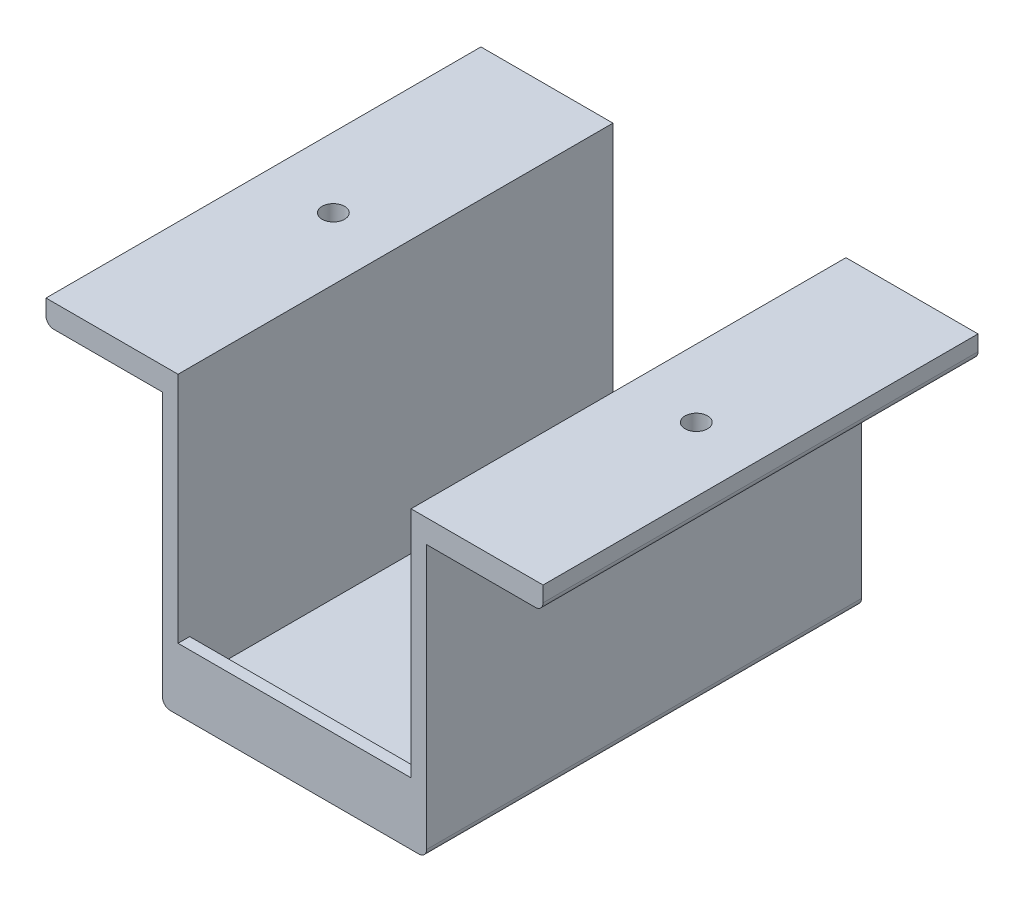
ISO-10303-21;
HEADER;
FILE_DESCRIPTION(('STEP AP214'),'2;1');
FILE_NAME('part.step','',(''),(''),'','','');
FILE_SCHEMA(('AUTOMOTIVE_DESIGN { 1 0 10303 214 1 1 1 1 }'));
ENDSEC;
DATA;
#1=APPLICATION_CONTEXT('core data for automotive mechanical design processes');
#2=APPLICATION_PROTOCOL_DEFINITION('international standard','automotive_design',2000,#1);
#3=PRODUCT_CONTEXT('',#1,'mechanical');
#4=PRODUCT('Part','Part','',(#3));
#5=PRODUCT_RELATED_PRODUCT_CATEGORY('part','',(#4));
#6=PRODUCT_DEFINITION_FORMATION('','',#4);
#7=PRODUCT_DEFINITION_CONTEXT('part definition',#1,'design');
#8=PRODUCT_DEFINITION('design','',#6,#7);
#9=PRODUCT_DEFINITION_SHAPE('','',#8);
#10=(LENGTH_UNIT() NAMED_UNIT(*) SI_UNIT(.MILLI.,.METRE.));
#11=(NAMED_UNIT(*) PLANE_ANGLE_UNIT() SI_UNIT($,.RADIAN.));
#12=(NAMED_UNIT(*) SI_UNIT($,.STERADIAN.) SOLID_ANGLE_UNIT());
#13=UNCERTAINTY_MEASURE_WITH_UNIT(LENGTH_MEASURE(1.E-05),#10,'distance_accuracy_value','');
#14=(GEOMETRIC_REPRESENTATION_CONTEXT(3) GLOBAL_UNCERTAINTY_ASSIGNED_CONTEXT((#13)) GLOBAL_UNIT_ASSIGNED_CONTEXT((#10,
#11,#12)) REPRESENTATION_CONTEXT('',''));
#15=CARTESIAN_POINT('',(0.,0.,0.));
#16=DIRECTION('',(0.,0.,1.));
#17=DIRECTION('',(1.,0.,0.));
#18=AXIS2_PLACEMENT_3D('',#15,#16,#17);
#19=CARTESIAN_POINT('',(0.,3.,0.));
#20=DIRECTION('',(0.,1.,0.));
#21=DIRECTION('',(0.,0.,1.));
#22=AXIS2_PLACEMENT_3D('',#19,#20,#21);
#23=PLANE('',#22);
#24=DIRECTION('',(0.,0.,1.));
#25=VECTOR('',#24,1.);
#26=CARTESIAN_POINT('',(32.,3.,-40.887459807074));
#27=LINE('',#26,#25);
#28=CARTESIAN_POINT('',(32.,3.,-38.887459807074));
#29=VERTEX_POINT('',#28);
#30=CARTESIAN_POINT('',(32.,3.,13.612540192926));
#31=VERTEX_POINT('',#30);
#32=EDGE_CURVE('E283',#29,#31,#27,.T.);
#33=ORIENTED_EDGE('',*,*,#32,.F.);
#34=DIRECTION('',(1.,0.,0.));
#35=VECTOR('',#34,1.);
#36=CARTESIAN_POINT('',(32.,3.,-38.887459807074));
#37=LINE('',#36,#35);
#38=CARTESIAN_POINT('',(2.,3.,-38.887459807074));
#39=VERTEX_POINT('',#38);
#40=EDGE_CURVE('E230',#39,#29,#37,.T.);
#41=ORIENTED_EDGE('',*,*,#40,.F.);
#42=DIRECTION('',(0.,0.,-1.));
#43=VECTOR('',#42,1.);
#44=CARTESIAN_POINT('',(2.,3.,-40.887459807074));
#45=LINE('',#44,#43);
#46=CARTESIAN_POINT('',(2.,3.,13.612540192926));
#47=VERTEX_POINT('',#46);
#48=EDGE_CURVE('E301',#47,#39,#45,.T.);
#49=ORIENTED_EDGE('',*,*,#48,.F.);
#50=DIRECTION('',(-1.,0.,0.));
#51=VECTOR('',#50,1.);
#52=CARTESIAN_POINT('',(2.,3.,13.612540192926));
#53=LINE('',#52,#51);
#54=EDGE_CURVE('E192',#31,#47,#53,.T.);
#55=ORIENTED_EDGE('',*,*,#54,.F.);
#56=EDGE_LOOP('',(#33,#41,#49,#55));
#57=FACE_BOUND('',#56,.T.);
#58=ADVANCED_FACE('F33',(#57),#23,.T.);
#59=CARTESIAN_POINT('',(2.,38.,-40.887459807074));
#60=DIRECTION('',(-1.,0.,0.));
#61=DIRECTION('',(0.,0.,1.));
#62=AXIS2_PLACEMENT_3D('',#59,#60,#61);
#63=PLANE('',#62);
#64=DIRECTION('',(0.,-1.,0.));
#65=VECTOR('',#64,1.);
#66=CARTESIAN_POINT('',(2.,8.,-38.887459807074));
#67=LINE('',#66,#65);
#68=CARTESIAN_POINT('',(2.,8.,-38.887459807074));
#69=VERTEX_POINT('',#68);
#70=EDGE_CURVE('E308',#69,#39,#67,.T.);
#71=ORIENTED_EDGE('',*,*,#70,.F.);
#72=DIRECTION('',(0.,0.,1.));
#73=VECTOR('',#72,1.);
#74=CARTESIAN_POINT('',(2.,8.,-40.887459807074));
#75=LINE('',#74,#73);
#76=CARTESIAN_POINT('',(2.,8.,-40.887459807074));
#77=VERTEX_POINT('',#76);
#78=EDGE_CURVE('E431',#77,#69,#75,.T.);
#79=ORIENTED_EDGE('',*,*,#78,.F.);
#80=DIRECTION('',(0.,-1.,0.));
#81=VECTOR('',#80,1.);
#82=CARTESIAN_POINT('',(2.,38.,-40.887459807074));
#83=LINE('',#82,#81);
#84=CARTESIAN_POINT('',(2.,38.,-40.887459807074));
#85=VERTEX_POINT('',#84);
#86=EDGE_CURVE('E198',#85,#77,#83,.T.);
#87=ORIENTED_EDGE('',*,*,#86,.F.);
#88=DIRECTION('',(0.,0.,-1.));
#89=VECTOR('',#88,1.);
#90=CARTESIAN_POINT('',(2.,38.,-40.887459807074));
#91=LINE('',#90,#89);
#92=CARTESIAN_POINT('',(2.,38.,15.112540192926));
#93=VERTEX_POINT('',#92);
#94=EDGE_CURVE('E196',#93,#85,#91,.T.);
#95=ORIENTED_EDGE('',*,*,#94,.F.);
#96=DIRECTION('',(0.,-1.,0.));
#97=VECTOR('',#96,1.);
#98=CARTESIAN_POINT('',(2.,38.,15.112540192926));
#99=LINE('',#98,#97);
#100=CARTESIAN_POINT('',(2.,8.,15.112540192926));
#101=VERTEX_POINT('',#100);
#102=EDGE_CURVE('E175',#93,#101,#99,.T.);
#103=ORIENTED_EDGE('',*,*,#102,.T.);
#104=DIRECTION('',(0.,0.,1.));
#105=VECTOR('',#104,1.);
#106=CARTESIAN_POINT('',(2.,8.,13.612540192926));
#107=LINE('',#106,#105);
#108=CARTESIAN_POINT('',(2.,8.,13.612540192926));
#109=VERTEX_POINT('',#108);
#110=EDGE_CURVE('E183',#109,#101,#107,.T.);
#111=ORIENTED_EDGE('',*,*,#110,.F.);
#112=DIRECTION('',(0.,-1.,0.));
#113=VECTOR('',#112,1.);
#114=CARTESIAN_POINT('',(2.,8.,13.612540192926));
#115=LINE('',#114,#113);
#116=EDGE_CURVE('E310',#109,#47,#115,.T.);
#117=ORIENTED_EDGE('',*,*,#116,.T.);
#118=ORIENTED_EDGE('',*,*,#48,.T.);
#119=EDGE_LOOP('',(#71,#79,#87,#95,#103,#111,#117,#118));
#120=FACE_BOUND('',#119,.T.);
#121=ADVANCED_FACE('F194',(#120),#63,.F.);
#122=CARTESIAN_POINT('',(32.,38.,-40.887459807074));
#123=DIRECTION('',(1.,0.,0.));
#124=DIRECTION('',(0.,0.,-1.));
#125=AXIS2_PLACEMENT_3D('',#122,#123,#124);
#126=PLANE('',#125);
#127=DIRECTION('',(0.,-1.,0.));
#128=VECTOR('',#127,1.);
#129=CARTESIAN_POINT('',(32.,8.,-38.887459807074));
#130=LINE('',#129,#128);
#131=CARTESIAN_POINT('',(32.,8.,-38.887459807074));
#132=VERTEX_POINT('',#131);
#133=EDGE_CURVE('E320',#132,#29,#130,.T.);
#134=ORIENTED_EDGE('',*,*,#133,.T.);
#135=ORIENTED_EDGE('',*,*,#32,.T.);
#136=DIRECTION('',(0.,-1.,0.));
#137=VECTOR('',#136,1.);
#138=CARTESIAN_POINT('',(32.,8.,13.612540192926));
#139=LINE('',#138,#137);
#140=CARTESIAN_POINT('',(32.,8.,13.612540192926));
#141=VERTEX_POINT('',#140);
#142=EDGE_CURVE('E329',#141,#31,#139,.T.);
#143=ORIENTED_EDGE('',*,*,#142,.F.);
#144=DIRECTION('',(0.,0.,-1.));
#145=VECTOR('',#144,1.);
#146=CARTESIAN_POINT('',(32.,8.,13.612540192926));
#147=LINE('',#146,#145);
#148=CARTESIAN_POINT('',(32.,8.,15.112540192926));
#149=VERTEX_POINT('',#148);
#150=EDGE_CURVE('E182',#149,#141,#147,.T.);
#151=ORIENTED_EDGE('',*,*,#150,.F.);
#152=DIRECTION('',(0.,-1.,0.));
#153=VECTOR('',#152,1.);
#154=CARTESIAN_POINT('',(32.,38.,15.112540192926));
#155=LINE('',#154,#153);
#156=CARTESIAN_POINT('',(32.,38.,15.112540192926));
#157=VERTEX_POINT('',#156);
#158=EDGE_CURVE('E179',#157,#149,#155,.T.);
#159=ORIENTED_EDGE('',*,*,#158,.F.);
#160=DIRECTION('',(0.,0.,1.));
#161=VECTOR('',#160,1.);
#162=CARTESIAN_POINT('',(32.,38.,-40.887459807074));
#163=LINE('',#162,#161);
#164=CARTESIAN_POINT('',(32.,38.,-40.887459807074));
#165=VERTEX_POINT('',#164);
#166=EDGE_CURVE('E293',#165,#157,#163,.T.);
#167=ORIENTED_EDGE('',*,*,#166,.F.);
#168=DIRECTION('',(0.,-1.,0.));
#169=VECTOR('',#168,1.);
#170=CARTESIAN_POINT('',(32.,38.,-40.887459807074));
#171=LINE('',#170,#169);
#172=CARTESIAN_POINT('',(32.,8.,-40.887459807074));
#173=VERTEX_POINT('',#172);
#174=EDGE_CURVE('E299',#165,#173,#171,.T.);
#175=ORIENTED_EDGE('',*,*,#174,.T.);
#176=DIRECTION('',(0.,0.,-1.));
#177=VECTOR('',#176,1.);
#178=CARTESIAN_POINT('',(32.,8.,-40.887459807074));
#179=LINE('',#178,#177);
#180=EDGE_CURVE('E432',#132,#173,#179,.T.);
#181=ORIENTED_EDGE('',*,*,#180,.F.);
#182=EDGE_LOOP('',(#134,#135,#143,#151,#159,#167,#175,#181));
#183=FACE_BOUND('',#182,.T.);
#184=ADVANCED_FACE('F382',(#183),#126,.F.);
#185=CARTESIAN_POINT('',(0.,3.,-40.887459807074));
#186=DIRECTION('',(1.,0.,0.));
#187=DIRECTION('',(0.,0.,-1.));
#188=AXIS2_PLACEMENT_3D('',#185,#186,#187);
#189=PLANE('',#188);
#190=DIRECTION('',(0.,-1.,0.));
#191=VECTOR('',#190,1.);
#192=CARTESIAN_POINT('',(0.,3.,-40.887459807074));
#193=LINE('',#192,#191);
#194=CARTESIAN_POINT('',(0.,35.0081400054375,-40.887459807074));
#195=VERTEX_POINT('',#194);
#196=CARTESIAN_POINT('',(0.,1.,-40.887459807074));
#197=VERTEX_POINT('',#196);
#198=EDGE_CURVE('E210',#195,#197,#193,.T.);
#199=ORIENTED_EDGE('',*,*,#198,.T.);
#200=DIRECTION('',(0.,0.,1.));
#201=VECTOR('',#200,1.);
#202=CARTESIAN_POINT('',(0.,1.,-40.887459807074));
#203=LINE('',#202,#201);
#204=CARTESIAN_POINT('',(0.,1.,15.112540192926));
#205=VERTEX_POINT('',#204);
#206=EDGE_CURVE('E11',#197,#205,#203,.T.);
#207=ORIENTED_EDGE('',*,*,#206,.T.);
#208=DIRECTION('',(0.,-1.,0.));
#209=VECTOR('',#208,1.);
#210=CARTESIAN_POINT('',(0.,3.,15.112540192926));
#211=LINE('',#210,#209);
#212=CARTESIAN_POINT('',(0.,35.0081400054375,15.112540192926));
#213=VERTEX_POINT('',#212);
#214=EDGE_CURVE('E219',#213,#205,#211,.T.);
#215=ORIENTED_EDGE('',*,*,#214,.F.);
#216=DIRECTION('',(0.,0.,1.));
#217=VECTOR('',#216,1.);
#218=CARTESIAN_POINT('',(0.,35.0081400054375,-40.887459807074));
#219=LINE('',#218,#217);
#220=EDGE_CURVE('E332',#195,#213,#219,.T.);
#221=ORIENTED_EDGE('',*,*,#220,.F.);
#222=EDGE_LOOP('',(#199,#207,#215,#221));
#223=FACE_BOUND('',#222,.T.);
#224=ADVANCED_FACE('F393',(#223),#189,.F.);
#225=CARTESIAN_POINT('',(34.,3.,-40.887459807074));
#226=DIRECTION('',(-1.,0.,0.));
#227=DIRECTION('',(0.,0.,1.));
#228=AXIS2_PLACEMENT_3D('',#225,#226,#227);
#229=PLANE('',#228);
#230=DIRECTION('',(0.,-1.,0.));
#231=VECTOR('',#230,1.);
#232=CARTESIAN_POINT('',(34.,3.,15.112540192926));
#233=LINE('',#232,#231);
#234=CARTESIAN_POINT('',(34.,35.0081400054375,15.112540192926));
#235=VERTEX_POINT('',#234);
#236=CARTESIAN_POINT('',(34.,1.,15.112540192926));
#237=VERTEX_POINT('',#236);
#238=EDGE_CURVE('E216',#235,#237,#233,.T.);
#239=ORIENTED_EDGE('',*,*,#238,.T.);
#240=DIRECTION('',(0.,0.,-1.));
#241=VECTOR('',#240,1.);
#242=CARTESIAN_POINT('',(34.,1.,-40.887459807074));
#243=LINE('',#242,#241);
#244=CARTESIAN_POINT('',(34.,1.,-40.887459807074));
#245=VERTEX_POINT('',#244);
#246=EDGE_CURVE('E254',#237,#245,#243,.T.);
#247=ORIENTED_EDGE('',*,*,#246,.T.);
#248=DIRECTION('',(0.,-1.,0.));
#249=VECTOR('',#248,1.);
#250=CARTESIAN_POINT('',(34.,3.,-40.887459807074));
#251=LINE('',#250,#249);
#252=CARTESIAN_POINT('',(34.,35.0081400054375,-40.887459807074));
#253=VERTEX_POINT('',#252);
#254=EDGE_CURVE('E213',#253,#245,#251,.T.);
#255=ORIENTED_EDGE('',*,*,#254,.F.);
#256=DIRECTION('',(0.,0.,-1.));
#257=VECTOR('',#256,1.);
#258=CARTESIAN_POINT('',(34.,35.0081400054375,15.112540192926));
#259=LINE('',#258,#257);
#260=EDGE_CURVE('E289',#235,#253,#259,.T.);
#261=ORIENTED_EDGE('',*,*,#260,.F.);
#262=EDGE_LOOP('',(#239,#247,#255,#261));
#263=FACE_BOUND('',#262,.T.);
#264=ADVANCED_FACE('F270',(#263),#229,.F.);
#265=CARTESIAN_POINT('',(0.,3.,15.112540192926));
#266=DIRECTION('',(0.,0.,-1.));
#267=DIRECTION('',(-1.,0.,0.));
#268=AXIS2_PLACEMENT_3D('',#265,#266,#267);
#269=PLANE('',#268);
#270=DIRECTION('',(-1.,0.,0.));
#271=VECTOR('',#270,1.);
#272=CARTESIAN_POINT('',(49.,35.0081400054375,15.112540192926));
#273=LINE('',#272,#271);
#274=CARTESIAN_POINT('',(48.,35.0081400054375,15.112540192926));
#275=VERTEX_POINT('',#274);
#276=EDGE_CURVE('E280',#275,#235,#273,.T.);
#277=ORIENTED_EDGE('',*,*,#276,.F.);
#278=CARTESIAN_POINT('',(48.,36.0081400054375,15.112540192926));
#279=DIRECTION('',(0.,0.,-1.));
#280=DIRECTION('',(-1.,0.,0.));
#281=AXIS2_PLACEMENT_3D('',#278,#279,#280);
#282=CIRCLE('',#281,1.);
#283=CARTESIAN_POINT('',(49.,36.0081400054375,15.112540192926));
#284=VERTEX_POINT('',#283);
#285=EDGE_CURVE('E247',#275,#284,#282,.F.);
#286=ORIENTED_EDGE('',*,*,#285,.T.);
#287=DIRECTION('',(0.,-1.,0.));
#288=VECTOR('',#287,1.);
#289=CARTESIAN_POINT('',(49.,38.,15.112540192926));
#290=LINE('',#289,#288);
#291=CARTESIAN_POINT('',(49.,38.,15.112540192926));
#292=VERTEX_POINT('',#291);
#293=EDGE_CURVE('E347',#292,#284,#290,.T.);
#294=ORIENTED_EDGE('',*,*,#293,.F.);
#295=DIRECTION('',(1.,0.,0.));
#296=VECTOR('',#295,1.);
#297=CARTESIAN_POINT('',(34.,38.,15.112540192926));
#298=LINE('',#297,#296);
#299=EDGE_CURVE('E295',#157,#292,#298,.T.);
#300=ORIENTED_EDGE('',*,*,#299,.F.);
#301=ORIENTED_EDGE('',*,*,#158,.T.);
#302=DIRECTION('',(1.,0.,0.));
#303=VECTOR('',#302,1.);
#304=CARTESIAN_POINT('',(2.,8.,15.112540192926));
#305=LINE('',#304,#303);
#306=EDGE_CURVE('E169',#101,#149,#305,.T.);
#307=ORIENTED_EDGE('',*,*,#306,.F.);
#308=ORIENTED_EDGE('',*,*,#102,.F.);
#309=DIRECTION('',(1.,0.,0.));
#310=VECTOR('',#309,1.);
#311=CARTESIAN_POINT('',(0.,38.,15.112540192926));
#312=LINE('',#311,#310);
#313=CARTESIAN_POINT('',(-15.,38.,15.112540192926));
#314=VERTEX_POINT('',#313);
#315=EDGE_CURVE('E302',#314,#93,#312,.T.);
#316=ORIENTED_EDGE('',*,*,#315,.F.);
#317=DIRECTION('',(0.,1.,0.));
#318=VECTOR('',#317,1.);
#319=CARTESIAN_POINT('',(-15.,38.,15.112540192926));
#320=LINE('',#319,#318);
#321=CARTESIAN_POINT('',(-15.,36.0081400054375,15.112540192926));
#322=VERTEX_POINT('',#321);
#323=EDGE_CURVE('E336',#322,#314,#320,.T.);
#324=ORIENTED_EDGE('',*,*,#323,.F.);
#325=CARTESIAN_POINT('',(-14.,36.0081400054375,15.112540192926));
#326=DIRECTION('',(0.,0.,-1.));
#327=DIRECTION('',(-1.,0.,0.));
#328=AXIS2_PLACEMENT_3D('',#325,#326,#327);
#329=CIRCLE('',#328,1.);
#330=CARTESIAN_POINT('',(-14.,35.0081400054375,15.112540192926));
#331=VERTEX_POINT('',#330);
#332=EDGE_CURVE('E55',#322,#331,#329,.F.);
#333=ORIENTED_EDGE('',*,*,#332,.T.);
#334=DIRECTION('',(1.,0.,0.));
#335=VECTOR('',#334,1.);
#336=CARTESIAN_POINT('',(-15.,35.0081400054375,15.112540192926));
#337=LINE('',#336,#335);
#338=EDGE_CURVE('E341',#331,#213,#337,.T.);
#339=ORIENTED_EDGE('',*,*,#338,.T.);
#340=ORIENTED_EDGE('',*,*,#214,.T.);
#341=CARTESIAN_POINT('',(1.,1.,15.112540192926));
#342=DIRECTION('',(0.,0.,-1.));
#343=DIRECTION('',(-1.,0.,0.));
#344=AXIS2_PLACEMENT_3D('',#341,#342,#343);
#345=CIRCLE('',#344,1.);
#346=CARTESIAN_POINT('',(1.,0.,15.112540192926));
#347=VERTEX_POINT('',#346);
#348=EDGE_CURVE('E48',#205,#347,#345,.F.);
#349=ORIENTED_EDGE('',*,*,#348,.T.);
#350=DIRECTION('',(1.,0.,0.));
#351=VECTOR('',#350,1.);
#352=CARTESIAN_POINT('',(0.,0.,15.112540192926));
#353=LINE('',#352,#351);
#354=CARTESIAN_POINT('',(33.,0.,15.112540192926));
#355=VERTEX_POINT('',#354);
#356=EDGE_CURVE('E197',#347,#355,#353,.T.);
#357=ORIENTED_EDGE('',*,*,#356,.T.);
#358=CARTESIAN_POINT('',(33.,1.,15.112540192926));
#359=DIRECTION('',(0.,0.,-1.));
#360=DIRECTION('',(-1.,0.,0.));
#361=AXIS2_PLACEMENT_3D('',#358,#359,#360);
#362=CIRCLE('',#361,1.);
#363=EDGE_CURVE('E244',#355,#237,#362,.F.);
#364=ORIENTED_EDGE('',*,*,#363,.T.);
#365=ORIENTED_EDGE('',*,*,#238,.F.);
#366=EDGE_LOOP('',(#277,#286,#294,#300,#301,#307,#308,#316,#324,#333,#339,#340,#349,#357,#364,#365));
#367=FACE_BOUND('',#366,.T.);
#368=ADVANCED_FACE('F172',(#367),#269,.F.);
#369=CARTESIAN_POINT('',(0.,3.,-40.887459807074));
#370=DIRECTION('',(0.,0.,1.));
#371=DIRECTION('',(1.,0.,0.));
#372=AXIS2_PLACEMENT_3D('',#369,#370,#371);
#373=PLANE('',#372);
#374=DIRECTION('',(0.,1.,0.));
#375=VECTOR('',#374,1.);
#376=CARTESIAN_POINT('',(49.,38.,-40.887459807074));
#377=LINE('',#376,#375);
#378=CARTESIAN_POINT('',(49.,36.0081400054375,-40.887459807074));
#379=VERTEX_POINT('',#378);
#380=CARTESIAN_POINT('',(49.,38.,-40.887459807074));
#381=VERTEX_POINT('',#380);
#382=EDGE_CURVE('E286',#379,#381,#377,.T.);
#383=ORIENTED_EDGE('',*,*,#382,.F.);
#384=CARTESIAN_POINT('',(48.,36.0081400054375,-40.887459807074));
#385=DIRECTION('',(0.,0.,1.));
#386=DIRECTION('',(1.,0.,0.));
#387=AXIS2_PLACEMENT_3D('',#384,#385,#386);
#388=CIRCLE('',#387,1.);
#389=CARTESIAN_POINT('',(48.,35.0081400054375,-40.887459807074));
#390=VERTEX_POINT('',#389);
#391=EDGE_CURVE('E239',#379,#390,#388,.F.);
#392=ORIENTED_EDGE('',*,*,#391,.T.);
#393=DIRECTION('',(-1.,0.,0.));
#394=VECTOR('',#393,1.);
#395=CARTESIAN_POINT('',(49.,35.0081400054375,-40.887459807074));
#396=LINE('',#395,#394);
#397=EDGE_CURVE('E277',#390,#253,#396,.T.);
#398=ORIENTED_EDGE('',*,*,#397,.T.);
#399=ORIENTED_EDGE('',*,*,#254,.T.);
#400=CARTESIAN_POINT('',(33.,1.,-40.887459807074));
#401=DIRECTION('',(0.,0.,1.));
#402=DIRECTION('',(1.,0.,0.));
#403=AXIS2_PLACEMENT_3D('',#400,#401,#402);
#404=CIRCLE('',#403,1.);
#405=CARTESIAN_POINT('',(33.,0.,-40.887459807074));
#406=VERTEX_POINT('',#405);
#407=EDGE_CURVE('E235',#245,#406,#404,.F.);
#408=ORIENTED_EDGE('',*,*,#407,.T.);
#409=DIRECTION('',(-1.,0.,0.));
#410=VECTOR('',#409,1.);
#411=CARTESIAN_POINT('',(0.,0.,-40.887459807074));
#412=LINE('',#411,#410);
#413=CARTESIAN_POINT('',(1.,0.,-40.887459807074));
#414=VERTEX_POINT('',#413);
#415=EDGE_CURVE('E201',#406,#414,#412,.T.);
#416=ORIENTED_EDGE('',*,*,#415,.T.);
#417=CARTESIAN_POINT('',(1.,1.,-40.887459807074));
#418=DIRECTION('',(0.,0.,1.));
#419=DIRECTION('',(1.,0.,0.));
#420=AXIS2_PLACEMENT_3D('',#417,#418,#419);
#421=CIRCLE('',#420,1.);
#422=EDGE_CURVE('E233',#414,#197,#421,.F.);
#423=ORIENTED_EDGE('',*,*,#422,.T.);
#424=ORIENTED_EDGE('',*,*,#198,.F.);
#425=DIRECTION('',(1.,0.,0.));
#426=VECTOR('',#425,1.);
#427=CARTESIAN_POINT('',(-15.,35.0081400054375,-40.887459807074));
#428=LINE('',#427,#426);
#429=CARTESIAN_POINT('',(-14.,35.0081400054375,-40.887459807074));
#430=VERTEX_POINT('',#429);
#431=EDGE_CURVE('E345',#430,#195,#428,.T.);
#432=ORIENTED_EDGE('',*,*,#431,.F.);
#433=CARTESIAN_POINT('',(-14.,36.0081400054375,-40.887459807074));
#434=DIRECTION('',(0.,0.,1.));
#435=DIRECTION('',(1.,0.,0.));
#436=AXIS2_PLACEMENT_3D('',#433,#434,#435);
#437=CIRCLE('',#436,1.);
#438=CARTESIAN_POINT('',(-15.,36.0081400054375,-40.887459807074));
#439=VERTEX_POINT('',#438);
#440=EDGE_CURVE('E237',#430,#439,#437,.F.);
#441=ORIENTED_EDGE('',*,*,#440,.T.);
#442=DIRECTION('',(0.,-1.,0.));
#443=VECTOR('',#442,1.);
#444=CARTESIAN_POINT('',(-15.,38.,-40.887459807074));
#445=LINE('',#444,#443);
#446=CARTESIAN_POINT('',(-15.,38.,-40.887459807074));
#447=VERTEX_POINT('',#446);
#448=EDGE_CURVE('E333',#447,#439,#445,.T.);
#449=ORIENTED_EDGE('',*,*,#448,.F.);
#450=DIRECTION('',(-1.,0.,0.));
#451=VECTOR('',#450,1.);
#452=CARTESIAN_POINT('',(0.,38.,-40.887459807074));
#453=LINE('',#452,#451);
#454=EDGE_CURVE('E204',#85,#447,#453,.T.);
#455=ORIENTED_EDGE('',*,*,#454,.F.);
#456=ORIENTED_EDGE('',*,*,#86,.T.);
#457=DIRECTION('',(-1.,0.,0.));
#458=VECTOR('',#457,1.);
#459=CARTESIAN_POINT('',(32.,8.,-40.887459807074));
#460=LINE('',#459,#458);
#461=EDGE_CURVE('E427',#173,#77,#460,.T.);
#462=ORIENTED_EDGE('',*,*,#461,.F.);
#463=ORIENTED_EDGE('',*,*,#174,.F.);
#464=DIRECTION('',(-1.,0.,0.));
#465=VECTOR('',#464,1.);
#466=CARTESIAN_POINT('',(34.,38.,-40.887459807074));
#467=LINE('',#466,#465);
#468=EDGE_CURVE('E291',#381,#165,#467,.T.);
#469=ORIENTED_EDGE('',*,*,#468,.F.);
#470=EDGE_LOOP('',(#383,#392,#398,#399,#408,#416,#423,#424,#432,#441,#449,#455,#456,#462,#463,#469));
#471=FACE_BOUND('',#470,.T.);
#472=ADVANCED_FACE('F275',(#471),#373,.F.);
#473=CARTESIAN_POINT('',(0.,0.,0.));
#474=DIRECTION('',(0.,1.,0.));
#475=DIRECTION('',(0.,0.,1.));
#476=AXIS2_PLACEMENT_3D('',#473,#474,#475);
#477=PLANE('',#476);
#478=ORIENTED_EDGE('',*,*,#415,.F.);
#479=DIRECTION('',(0.,0.,-1.));
#480=VECTOR('',#479,1.);
#481=CARTESIAN_POINT('',(33.,0.,0.));
#482=LINE('',#481,#480);
#483=EDGE_CURVE('E41',#406,#355,#482,.F.);
#484=ORIENTED_EDGE('',*,*,#483,.T.);
#485=ORIENTED_EDGE('',*,*,#356,.F.);
#486=DIRECTION('',(0.,0.,1.));
#487=VECTOR('',#486,1.);
#488=CARTESIAN_POINT('',(1.,0.,0.));
#489=LINE('',#488,#487);
#490=EDGE_CURVE('E257',#347,#414,#489,.F.);
#491=ORIENTED_EDGE('',*,*,#490,.T.);
#492=EDGE_LOOP('',(#478,#484,#485,#491));
#493=FACE_BOUND('',#492,.T.);
#494=ADVANCED_FACE('F262',(#493),#477,.F.);
#495=CARTESIAN_POINT('',(0.,38.,0.));
#496=DIRECTION('',(0.,1.,0.));
#497=DIRECTION('',(0.,0.,1.));
#498=AXIS2_PLACEMENT_3D('',#495,#496,#497);
#499=PLANE('',#498);
#500=CARTESIAN_POINT('',(-6.00207216619672,38.,-12.887459807074));
#501=DIRECTION('',(0.,1.,0.));
#502=DIRECTION('',(0.,0.,1.));
#503=AXIS2_PLACEMENT_3D('',#500,#501,#502);
#504=CIRCLE('',#503,1.45);
#505=CARTESIAN_POINT('',(-6.00207216619672,38.,-11.437459807074));
#506=VERTEX_POINT('',#505);
#507=EDGE_CURVE('E227',#506,#506,#504,.T.);
#508=ORIENTED_EDGE('',*,*,#507,.F.);
#509=EDGE_LOOP('',(#508));
#510=FACE_BOUND('',#509,.T.);
#511=ORIENTED_EDGE('',*,*,#454,.T.);
#512=DIRECTION('',(0.,0.,-1.));
#513=VECTOR('',#512,1.);
#514=CARTESIAN_POINT('',(-15.,38.,-40.887459807074));
#515=LINE('',#514,#513);
#516=EDGE_CURVE('E338',#314,#447,#515,.T.);
#517=ORIENTED_EDGE('',*,*,#516,.F.);
#518=ORIENTED_EDGE('',*,*,#315,.T.);
#519=ORIENTED_EDGE('',*,*,#94,.T.);
#520=EDGE_LOOP('',(#511,#517,#518,#519));
#521=FACE_BOUND('',#520,.T.);
#522=ADVANCED_FACE('F374',(#510,#521),#499,.T.);
#523=CARTESIAN_POINT('',(0.,38.,0.));
#524=DIRECTION('',(0.,-1.,0.));
#525=DIRECTION('',(0.,0.,-1.));
#526=AXIS2_PLACEMENT_3D('',#523,#524,#525);
#527=PLANE('',#526);
#528=CARTESIAN_POINT('',(40.7304321433144,38.,-12.887459807074));
#529=DIRECTION('',(0.,1.,0.));
#530=DIRECTION('',(0.,0.,1.));
#531=AXIS2_PLACEMENT_3D('',#528,#529,#530);
#532=CIRCLE('',#531,1.45);
#533=CARTESIAN_POINT('',(40.7304321433144,38.,-11.437459807074));
#534=VERTEX_POINT('',#533);
#535=EDGE_CURVE('E648',#534,#534,#532,.T.);
#536=ORIENTED_EDGE('',*,*,#535,.F.);
#537=EDGE_LOOP('',(#536));
#538=FACE_BOUND('',#537,.T.);
#539=ORIENTED_EDGE('',*,*,#299,.T.);
#540=DIRECTION('',(0.,0.,1.));
#541=VECTOR('',#540,1.);
#542=CARTESIAN_POINT('',(49.,38.,15.112540192926));
#543=LINE('',#542,#541);
#544=EDGE_CURVE('E281',#381,#292,#543,.T.);
#545=ORIENTED_EDGE('',*,*,#544,.F.);
#546=ORIENTED_EDGE('',*,*,#468,.T.);
#547=ORIENTED_EDGE('',*,*,#166,.T.);
#548=EDGE_LOOP('',(#539,#545,#546,#547));
#549=FACE_BOUND('',#548,.T.);
#550=ADVANCED_FACE('F360',(#538,#549),#527,.F.);
#551=CARTESIAN_POINT('',(49.,35.0081400054375,15.112540192926));
#552=DIRECTION('',(0.,1.,0.));
#553=DIRECTION('',(0.,0.,1.));
#554=AXIS2_PLACEMENT_3D('',#551,#552,#553);
#555=PLANE('',#554);
#556=CARTESIAN_POINT('',(40.7304321433144,35.0081400054375,-12.887459807074));
#557=DIRECTION('',(0.,1.,0.));
#558=DIRECTION('',(0.,0.,1.));
#559=AXIS2_PLACEMENT_3D('',#556,#557,#558);
#560=CIRCLE('',#559,1.45);
#561=CARTESIAN_POINT('',(40.7304321433144,35.0081400054375,-11.437459807074));
#562=VERTEX_POINT('',#561);
#563=EDGE_CURVE('E226',#562,#562,#560,.T.);
#564=ORIENTED_EDGE('',*,*,#563,.T.);
#565=EDGE_LOOP('',(#564));
#566=FACE_BOUND('',#565,.T.);
#567=ORIENTED_EDGE('',*,*,#397,.F.);
#568=DIRECTION('',(0.,0.,-1.));
#569=VECTOR('',#568,1.);
#570=CARTESIAN_POINT('',(48.,35.0081400054375,15.112540192926));
#571=LINE('',#570,#569);
#572=EDGE_CURVE('E241',#390,#275,#571,.F.);
#573=ORIENTED_EDGE('',*,*,#572,.T.);
#574=ORIENTED_EDGE('',*,*,#276,.T.);
#575=ORIENTED_EDGE('',*,*,#260,.T.);
#576=EDGE_LOOP('',(#567,#573,#574,#575));
#577=FACE_BOUND('',#576,.T.);
#578=ADVANCED_FACE('F364',(#566,#577),#555,.F.);
#579=CARTESIAN_POINT('',(49.,0.,0.));
#580=DIRECTION('',(1.,0.,0.));
#581=DIRECTION('',(0.,0.,-1.));
#582=AXIS2_PLACEMENT_3D('',#579,#580,#581);
#583=PLANE('',#582);
#584=ORIENTED_EDGE('',*,*,#293,.T.);
#585=DIRECTION('',(0.,0.,-1.));
#586=VECTOR('',#585,1.);
#587=CARTESIAN_POINT('',(49.,36.0081400054375,-40.887459807074));
#588=LINE('',#587,#586);
#589=EDGE_CURVE('E222',#284,#379,#588,.T.);
#590=ORIENTED_EDGE('',*,*,#589,.T.);
#591=ORIENTED_EDGE('',*,*,#382,.T.);
#592=ORIENTED_EDGE('',*,*,#544,.T.);
#593=EDGE_LOOP('',(#584,#590,#591,#592));
#594=FACE_BOUND('',#593,.T.);
#595=ADVANCED_FACE('F352',(#594),#583,.T.);
#596=CARTESIAN_POINT('',(-15.,35.0081400054375,-40.887459807074));
#597=DIRECTION('',(0.,1.,0.));
#598=DIRECTION('',(0.,0.,1.));
#599=AXIS2_PLACEMENT_3D('',#596,#597,#598);
#600=PLANE('',#599);
#601=CARTESIAN_POINT('',(-6.00207216619672,35.0081400054375,-12.887459807074));
#602=DIRECTION('',(0.,1.,0.));
#603=DIRECTION('',(0.,0.,1.));
#604=AXIS2_PLACEMENT_3D('',#601,#602,#603);
#605=CIRCLE('',#604,1.45);
#606=CARTESIAN_POINT('',(-6.00207216619672,35.0081400054375,-11.437459807074));
#607=VERTEX_POINT('',#606);
#608=EDGE_CURVE('E223',#607,#607,#605,.T.);
#609=ORIENTED_EDGE('',*,*,#608,.T.);
#610=EDGE_LOOP('',(#609));
#611=FACE_BOUND('',#610,.T.);
#612=ORIENTED_EDGE('',*,*,#338,.F.);
#613=DIRECTION('',(0.,0.,1.));
#614=VECTOR('',#613,1.);
#615=CARTESIAN_POINT('',(-14.,35.0081400054375,-40.887459807074));
#616=LINE('',#615,#614);
#617=EDGE_CURVE('E252',#331,#430,#616,.F.);
#618=ORIENTED_EDGE('',*,*,#617,.T.);
#619=ORIENTED_EDGE('',*,*,#431,.T.);
#620=ORIENTED_EDGE('',*,*,#220,.T.);
#621=EDGE_LOOP('',(#612,#618,#619,#620));
#622=FACE_BOUND('',#621,.T.);
#623=ADVANCED_FACE('F372',(#611,#622),#600,.F.);
#624=CARTESIAN_POINT('',(-15.,0.,0.));
#625=DIRECTION('',(-1.,0.,0.));
#626=DIRECTION('',(0.,0.,1.));
#627=AXIS2_PLACEMENT_3D('',#624,#625,#626);
#628=PLANE('',#627);
#629=ORIENTED_EDGE('',*,*,#448,.T.);
#630=DIRECTION('',(0.,0.,1.));
#631=VECTOR('',#630,1.);
#632=CARTESIAN_POINT('',(-15.,36.0081400054375,15.112540192926));
#633=LINE('',#632,#631);
#634=EDGE_CURVE('E249',#439,#322,#633,.T.);
#635=ORIENTED_EDGE('',*,*,#634,.T.);
#636=ORIENTED_EDGE('',*,*,#323,.T.);
#637=ORIENTED_EDGE('',*,*,#516,.T.);
#638=EDGE_LOOP('',(#629,#635,#636,#637));
#639=FACE_BOUND('',#638,.T.);
#640=ADVANCED_FACE('F422',(#639),#628,.T.);
#641=CARTESIAN_POINT('',(2.,8.,13.612540192926));
#642=DIRECTION('',(0.,0.,1.));
#643=DIRECTION('',(1.,0.,0.));
#644=AXIS2_PLACEMENT_3D('',#641,#642,#643);
#645=PLANE('',#644);
#646=ORIENTED_EDGE('',*,*,#54,.T.);
#647=ORIENTED_EDGE('',*,*,#116,.F.);
#648=DIRECTION('',(-1.,0.,0.));
#649=VECTOR('',#648,1.);
#650=CARTESIAN_POINT('',(2.,8.,13.612540192926));
#651=LINE('',#650,#649);
#652=EDGE_CURVE('E188',#141,#109,#651,.T.);
#653=ORIENTED_EDGE('',*,*,#652,.F.);
#654=ORIENTED_EDGE('',*,*,#142,.T.);
#655=EDGE_LOOP('',(#646,#647,#653,#654));
#656=FACE_BOUND('',#655,.T.);
#657=ADVANCED_FACE('F441',(#656),#645,.F.);
#658=CARTESIAN_POINT('',(0.,8.,0.));
#659=DIRECTION('',(0.,1.,0.));
#660=DIRECTION('',(0.,0.,1.));
#661=AXIS2_PLACEMENT_3D('',#658,#659,#660);
#662=PLANE('',#661);
#663=ORIENTED_EDGE('',*,*,#110,.T.);
#664=ORIENTED_EDGE('',*,*,#306,.T.);
#665=ORIENTED_EDGE('',*,*,#150,.T.);
#666=ORIENTED_EDGE('',*,*,#652,.T.);
#667=EDGE_LOOP('',(#663,#664,#665,#666));
#668=FACE_BOUND('',#667,.T.);
#669=ADVANCED_FACE('F186',(#668),#662,.T.);
#670=CARTESIAN_POINT('',(32.,8.,-38.887459807074));
#671=DIRECTION('',(0.,0.,-1.));
#672=DIRECTION('',(-1.,0.,0.));
#673=AXIS2_PLACEMENT_3D('',#670,#671,#672);
#674=PLANE('',#673);
#675=ORIENTED_EDGE('',*,*,#40,.T.);
#676=ORIENTED_EDGE('',*,*,#133,.F.);
#677=DIRECTION('',(1.,0.,0.));
#678=VECTOR('',#677,1.);
#679=CARTESIAN_POINT('',(32.,8.,-38.887459807074));
#680=LINE('',#679,#678);
#681=EDGE_CURVE('E319',#69,#132,#680,.T.);
#682=ORIENTED_EDGE('',*,*,#681,.F.);
#683=ORIENTED_EDGE('',*,*,#70,.T.);
#684=EDGE_LOOP('',(#675,#676,#682,#683));
#685=FACE_BOUND('',#684,.T.);
#686=ADVANCED_FACE('F316',(#685),#674,.F.);
#687=CARTESIAN_POINT('',(0.,8.,0.));
#688=DIRECTION('',(0.,-1.,0.));
#689=DIRECTION('',(0.,0.,-1.));
#690=AXIS2_PLACEMENT_3D('',#687,#688,#689);
#691=PLANE('',#690);
#692=ORIENTED_EDGE('',*,*,#180,.T.);
#693=ORIENTED_EDGE('',*,*,#461,.T.);
#694=ORIENTED_EDGE('',*,*,#78,.T.);
#695=ORIENTED_EDGE('',*,*,#681,.T.);
#696=EDGE_LOOP('',(#692,#693,#694,#695));
#697=FACE_BOUND('',#696,.T.);
#698=ADVANCED_FACE('F430',(#697),#691,.F.);
#699=CARTESIAN_POINT('',(-6.00207216619672,0.,-12.887459807074));
#700=DIRECTION('',(0.,1.,0.));
#701=DIRECTION('',(0.,0.,1.));
#702=AXIS2_PLACEMENT_3D('',#699,#700,#701);
#703=CYLINDRICAL_SURFACE('',#702,1.45);
#704=ORIENTED_EDGE('',*,*,#507,.T.);
#705=EDGE_LOOP('',(#704));
#706=FACE_BOUND('',#705,.T.);
#707=ORIENTED_EDGE('',*,*,#608,.F.);
#708=EDGE_LOOP('',(#707));
#709=FACE_BOUND('',#708,.T.);
#710=ADVANCED_FACE('F458',(#706,#709),#703,.F.);
#711=CARTESIAN_POINT('',(40.7304321433144,0.,-12.887459807074));
#712=DIRECTION('',(0.,1.,0.));
#713=DIRECTION('',(0.,0.,1.));
#714=AXIS2_PLACEMENT_3D('',#711,#712,#713);
#715=CYLINDRICAL_SURFACE('',#714,1.45);
#716=ORIENTED_EDGE('',*,*,#535,.T.);
#717=EDGE_LOOP('',(#716));
#718=FACE_BOUND('',#717,.T.);
#719=ORIENTED_EDGE('',*,*,#563,.F.);
#720=EDGE_LOOP('',(#719));
#721=FACE_BOUND('',#720,.T.);
#722=ADVANCED_FACE('F402',(#718,#721),#715,.F.);
#723=CARTESIAN_POINT('',(48.,36.0081400054375,0.));
#724=DIRECTION('',(0.,0.,1.));
#725=DIRECTION('',(1.,0.,0.));
#726=AXIS2_PLACEMENT_3D('',#723,#724,#725);
#727=CYLINDRICAL_SURFACE('',#726,1.);
#728=ORIENTED_EDGE('',*,*,#285,.F.);
#729=ORIENTED_EDGE('',*,*,#572,.F.);
#730=ORIENTED_EDGE('',*,*,#391,.F.);
#731=ORIENTED_EDGE('',*,*,#589,.F.);
#732=EDGE_LOOP('',(#728,#729,#730,#731));
#733=FACE_BOUND('',#732,.T.);
#734=ADVANCED_FACE('F363',(#733),#727,.T.);
#735=CARTESIAN_POINT('',(-14.,36.0081400054375,0.));
#736=DIRECTION('',(0.,0.,-1.));
#737=DIRECTION('',(-1.,0.,0.));
#738=AXIS2_PLACEMENT_3D('',#735,#736,#737);
#739=CYLINDRICAL_SURFACE('',#738,1.);
#740=ORIENTED_EDGE('',*,*,#440,.F.);
#741=ORIENTED_EDGE('',*,*,#617,.F.);
#742=ORIENTED_EDGE('',*,*,#332,.F.);
#743=ORIENTED_EDGE('',*,*,#634,.F.);
#744=EDGE_LOOP('',(#740,#741,#742,#743));
#745=FACE_BOUND('',#744,.T.);
#746=ADVANCED_FACE('F401',(#745),#739,.T.);
#747=CARTESIAN_POINT('',(33.,1.,-40.887459807074));
#748=DIRECTION('',(0.,0.,-1.));
#749=DIRECTION('',(-1.,0.,0.));
#750=AXIS2_PLACEMENT_3D('',#747,#748,#749);
#751=CYLINDRICAL_SURFACE('',#750,1.);
#752=ORIENTED_EDGE('',*,*,#363,.F.);
#753=ORIENTED_EDGE('',*,*,#483,.F.);
#754=ORIENTED_EDGE('',*,*,#407,.F.);
#755=ORIENTED_EDGE('',*,*,#246,.F.);
#756=EDGE_LOOP('',(#752,#753,#754,#755));
#757=FACE_BOUND('',#756,.T.);
#758=ADVANCED_FACE('F267',(#757),#751,.T.);
#759=CARTESIAN_POINT('',(1.,1.,-40.887459807074));
#760=DIRECTION('',(0.,0.,1.));
#761=DIRECTION('',(1.,0.,0.));
#762=AXIS2_PLACEMENT_3D('',#759,#760,#761);
#763=CYLINDRICAL_SURFACE('',#762,1.);
#764=ORIENTED_EDGE('',*,*,#422,.F.);
#765=ORIENTED_EDGE('',*,*,#490,.F.);
#766=ORIENTED_EDGE('',*,*,#348,.F.);
#767=ORIENTED_EDGE('',*,*,#206,.F.);
#768=EDGE_LOOP('',(#764,#765,#766,#767));
#769=FACE_BOUND('',#768,.T.);
#770=ADVANCED_FACE('F35',(#769),#763,.T.);
#771=CLOSED_SHELL('',(#58,#121,#184,#224,#264,#368,#472,#494,#522,#550,#578,#595,#623,#640,#657,
#669,#686,#698,#710,#722,#734,#746,#758,#770));
#772=MANIFOLD_SOLID_BREP('B2',#771);
#773=ADVANCED_BREP_SHAPE_REPRESENTATION('',(#18,#772),#14);
#774=SHAPE_DEFINITION_REPRESENTATION(#9,#773);
ENDSEC;
END-ISO-10303-21;
